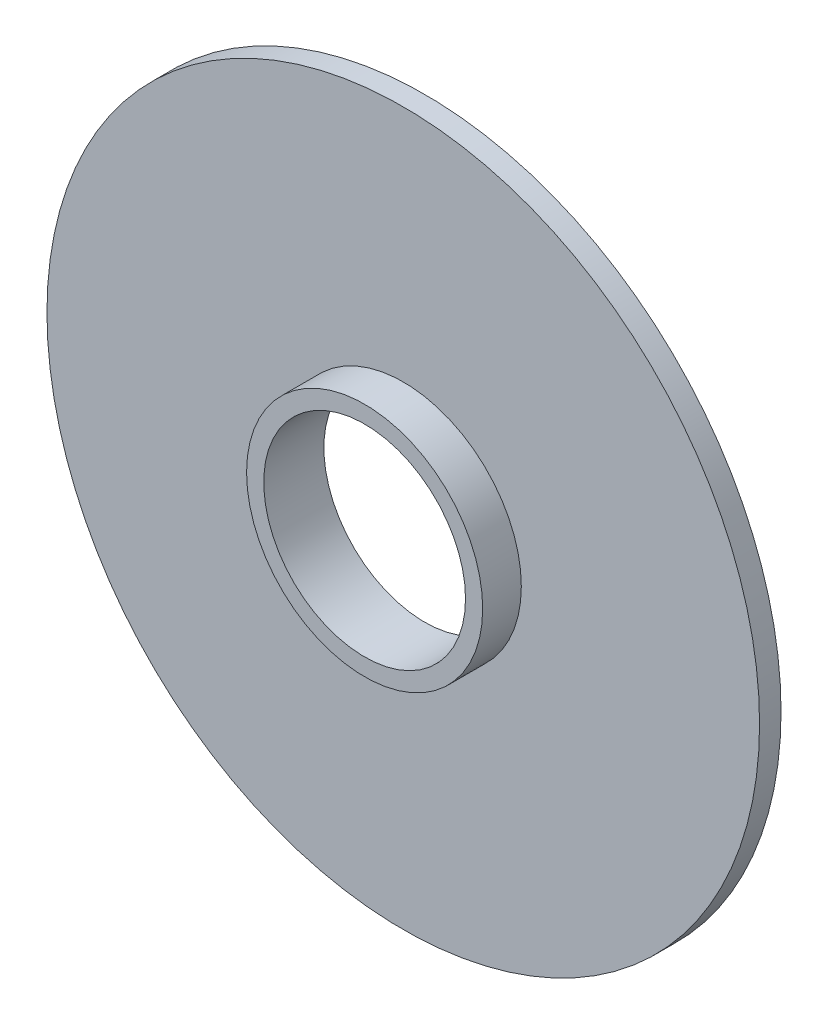
ISO-10303-21;
HEADER;
FILE_DESCRIPTION(('STEP AP214'),'2;1');
FILE_NAME('part.step','',(''),(''),'','','');
FILE_SCHEMA(('AUTOMOTIVE_DESIGN { 1 0 10303 214 1 1 1 1 }'));
ENDSEC;
DATA;
#1=APPLICATION_CONTEXT('core data for automotive mechanical design processes');
#2=APPLICATION_PROTOCOL_DEFINITION('international standard','automotive_design',2000,#1);
#3=PRODUCT_CONTEXT('',#1,'mechanical');
#4=PRODUCT('Part','Part','',(#3));
#5=PRODUCT_RELATED_PRODUCT_CATEGORY('part','',(#4));
#6=PRODUCT_DEFINITION_FORMATION('','',#4);
#7=PRODUCT_DEFINITION_CONTEXT('part definition',#1,'design');
#8=PRODUCT_DEFINITION('design','',#6,#7);
#9=PRODUCT_DEFINITION_SHAPE('','',#8);
#10=(LENGTH_UNIT() NAMED_UNIT(*) SI_UNIT(.MILLI.,.METRE.));
#11=(NAMED_UNIT(*) PLANE_ANGLE_UNIT() SI_UNIT($,.RADIAN.));
#12=(NAMED_UNIT(*) SI_UNIT($,.STERADIAN.) SOLID_ANGLE_UNIT());
#13=UNCERTAINTY_MEASURE_WITH_UNIT(LENGTH_MEASURE(1.E-05),#10,'distance_accuracy_value','');
#14=(GEOMETRIC_REPRESENTATION_CONTEXT(3) GLOBAL_UNCERTAINTY_ASSIGNED_CONTEXT((#13)) GLOBAL_UNIT_ASSIGNED_CONTEXT((#10,
#11,#12)) REPRESENTATION_CONTEXT('',''));
#15=CARTESIAN_POINT('',(0.,0.,0.));
#16=DIRECTION('',(0.,0.,1.));
#17=DIRECTION('',(1.,0.,0.));
#18=AXIS2_PLACEMENT_3D('',#15,#16,#17);
#19=CARTESIAN_POINT('',(0.,0.,-35.));
#20=DIRECTION('',(0.,0.,1.));
#21=DIRECTION('',(1.,0.,0.));
#22=AXIS2_PLACEMENT_3D('',#19,#20,#21);
#23=PLANE('',#22);
#24=CARTESIAN_POINT('',(0.,0.,-35.));
#25=DIRECTION('',(0.,0.,1.));
#26=DIRECTION('',(1.,0.,0.));
#27=AXIS2_PLACEMENT_3D('',#24,#25,#26);
#28=CIRCLE('',#27,83.);
#29=CARTESIAN_POINT('',(83.,0.,-35.));
#30=VERTEX_POINT('',#29);
#31=EDGE_CURVE('E10',#30,#30,#28,.T.);
#32=ORIENTED_EDGE('',*,*,#31,.T.);
#33=EDGE_LOOP('',(#32));
#34=FACE_BOUND('',#33,.T.);
#35=CARTESIAN_POINT('',(0.,0.,-35.));
#36=DIRECTION('',(0.,0.,1.));
#37=DIRECTION('',(1.,0.,0.));
#38=AXIS2_PLACEMENT_3D('',#35,#36,#37);
#39=CIRCLE('',#38,27.5);
#40=CARTESIAN_POINT('',(27.5,0.,-35.));
#41=VERTEX_POINT('',#40);
#42=EDGE_CURVE('E50',#41,#41,#39,.F.);
#43=ORIENTED_EDGE('',*,*,#42,.T.);
#44=EDGE_LOOP('',(#43));
#45=FACE_BOUND('',#44,.T.);
#46=ADVANCED_FACE('F35',(#34,#45),#23,.T.);
#47=CARTESIAN_POINT('',(0.,0.,-40.));
#48=DIRECTION('',(0.,0.,1.));
#49=DIRECTION('',(1.,0.,0.));
#50=AXIS2_PLACEMENT_3D('',#47,#48,#49);
#51=PLANE('',#50);
#52=CARTESIAN_POINT('',(0.,0.,-40.));
#53=DIRECTION('',(0.,0.,1.));
#54=DIRECTION('',(1.,0.,0.));
#55=AXIS2_PLACEMENT_3D('',#52,#53,#54);
#56=CIRCLE('',#55,23.5);
#57=CARTESIAN_POINT('',(23.5,0.,-40.));
#58=VERTEX_POINT('',#57);
#59=EDGE_CURVE('E46',#58,#58,#56,.T.);
#60=ORIENTED_EDGE('',*,*,#59,.T.);
#61=EDGE_LOOP('',(#60));
#62=FACE_BOUND('',#61,.T.);
#63=CARTESIAN_POINT('',(0.,0.,-40.));
#64=DIRECTION('',(0.,0.,1.));
#65=DIRECTION('',(1.,0.,0.));
#66=AXIS2_PLACEMENT_3D('',#63,#64,#65);
#67=CIRCLE('',#66,83.);
#68=CARTESIAN_POINT('',(83.,0.,-40.));
#69=VERTEX_POINT('',#68);
#70=EDGE_CURVE('E39',#69,#69,#67,.T.);
#71=ORIENTED_EDGE('',*,*,#70,.F.);
#72=EDGE_LOOP('',(#71));
#73=FACE_BOUND('',#72,.T.);
#74=ADVANCED_FACE('F76',(#62,#73),#51,.F.);
#75=CARTESIAN_POINT('',(0.,0.,-35.));
#76=DIRECTION('',(0.,0.,-1.));
#77=DIRECTION('',(-1.,0.,0.));
#78=AXIS2_PLACEMENT_3D('',#75,#76,#77);
#79=CYLINDRICAL_SURFACE('',#78,83.);
#80=ORIENTED_EDGE('',*,*,#31,.F.);
#81=EDGE_LOOP('',(#80));
#82=FACE_BOUND('',#81,.T.);
#83=ORIENTED_EDGE('',*,*,#70,.T.);
#84=EDGE_LOOP('',(#83));
#85=FACE_BOUND('',#84,.T.);
#86=ADVANCED_FACE('F37',(#82,#85),#79,.T.);
#87=CARTESIAN_POINT('',(0.,0.,-35.));
#88=DIRECTION('',(0.,0.,-1.));
#89=DIRECTION('',(-1.,0.,0.));
#90=AXIS2_PLACEMENT_3D('',#87,#88,#89);
#91=CYLINDRICAL_SURFACE('',#90,23.5);
#92=ORIENTED_EDGE('',*,*,#59,.F.);
#93=EDGE_LOOP('',(#92));
#94=FACE_BOUND('',#93,.T.);
#95=CARTESIAN_POINT('',(0.,0.,-26.));
#96=DIRECTION('',(0.,0.,1.));
#97=DIRECTION('',(1.,0.,0.));
#98=AXIS2_PLACEMENT_3D('',#95,#96,#97);
#99=CIRCLE('',#98,23.5);
#100=CARTESIAN_POINT('',(23.5,0.,-26.));
#101=VERTEX_POINT('',#100);
#102=EDGE_CURVE('E56',#101,#101,#99,.T.);
#103=ORIENTED_EDGE('',*,*,#102,.T.);
#104=EDGE_LOOP('',(#103));
#105=FACE_BOUND('',#104,.T.);
#106=ADVANCED_FACE('F60',(#94,#105),#91,.F.);
#107=CARTESIAN_POINT('',(0.,0.,-26.));
#108=DIRECTION('',(0.,0.,1.));
#109=DIRECTION('',(1.,0.,0.));
#110=AXIS2_PLACEMENT_3D('',#107,#108,#109);
#111=PLANE('',#110);
#112=CARTESIAN_POINT('',(0.,0.,-26.));
#113=DIRECTION('',(0.,0.,1.));
#114=DIRECTION('',(1.,0.,0.));
#115=AXIS2_PLACEMENT_3D('',#112,#113,#114);
#116=CIRCLE('',#115,27.5);
#117=CARTESIAN_POINT('',(27.5,0.,-26.));
#118=VERTEX_POINT('',#117);
#119=EDGE_CURVE('E53',#118,#118,#116,.T.);
#120=ORIENTED_EDGE('',*,*,#119,.T.);
#121=EDGE_LOOP('',(#120));
#122=FACE_BOUND('',#121,.T.);
#123=ORIENTED_EDGE('',*,*,#102,.F.);
#124=EDGE_LOOP('',(#123));
#125=FACE_BOUND('',#124,.T.);
#126=ADVANCED_FACE('F62',(#122,#125),#111,.T.);
#127=CARTESIAN_POINT('',(0.,0.,-26.));
#128=DIRECTION('',(0.,0.,-1.));
#129=DIRECTION('',(-1.,0.,0.));
#130=AXIS2_PLACEMENT_3D('',#127,#128,#129);
#131=CYLINDRICAL_SURFACE('',#130,27.5);
#132=ORIENTED_EDGE('',*,*,#42,.F.);
#133=EDGE_LOOP('',(#132));
#134=FACE_BOUND('',#133,.T.);
#135=ORIENTED_EDGE('',*,*,#119,.F.);
#136=EDGE_LOOP('',(#135));
#137=FACE_BOUND('',#136,.T.);
#138=ADVANCED_FACE('F64',(#134,#137),#131,.T.);
#139=CLOSED_SHELL('',(#46,#74,#86,#106,#126,#138));
#140=MANIFOLD_SOLID_BREP('B2',#139);
#141=ADVANCED_BREP_SHAPE_REPRESENTATION('',(#18,#140),#14);
#142=SHAPE_DEFINITION_REPRESENTATION(#9,#141);
ENDSEC;
END-ISO-10303-21;
